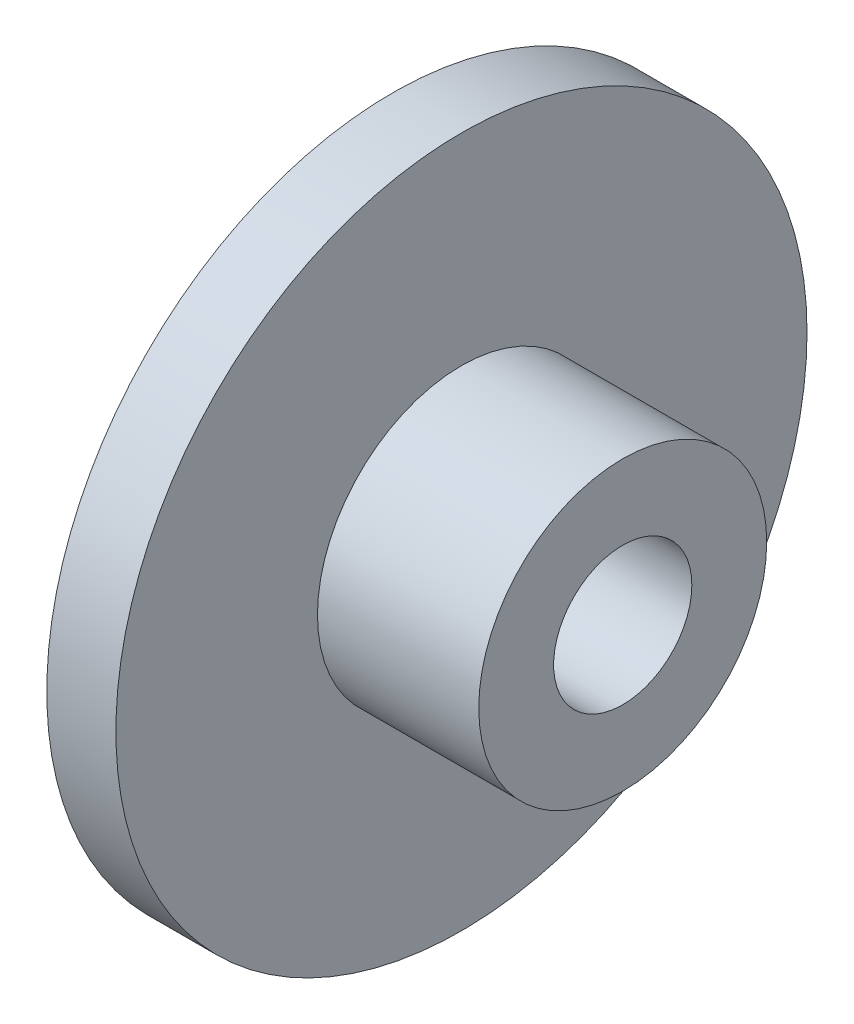
ISO-10303-21;
HEADER;
FILE_DESCRIPTION(('STEP AP214'),'2;1');
FILE_NAME('part.step','',(''),(''),'','','');
FILE_SCHEMA(('AUTOMOTIVE_DESIGN { 1 0 10303 214 1 1 1 1 }'));
ENDSEC;
DATA;
#1=APPLICATION_CONTEXT('core data for automotive mechanical design processes');
#2=APPLICATION_PROTOCOL_DEFINITION('international standard','automotive_design',2000,#1);
#3=PRODUCT_CONTEXT('',#1,'mechanical');
#4=PRODUCT('Part','Part','',(#3));
#5=PRODUCT_RELATED_PRODUCT_CATEGORY('part','',(#4));
#6=PRODUCT_DEFINITION_FORMATION('','',#4);
#7=PRODUCT_DEFINITION_CONTEXT('part definition',#1,'design');
#8=PRODUCT_DEFINITION('design','',#6,#7);
#9=PRODUCT_DEFINITION_SHAPE('','',#8);
#10=(LENGTH_UNIT() NAMED_UNIT(*) SI_UNIT(.MILLI.,.METRE.));
#11=(NAMED_UNIT(*) PLANE_ANGLE_UNIT() SI_UNIT($,.RADIAN.));
#12=(NAMED_UNIT(*) SI_UNIT($,.STERADIAN.) SOLID_ANGLE_UNIT());
#13=UNCERTAINTY_MEASURE_WITH_UNIT(LENGTH_MEASURE(1.E-05),#10,'distance_accuracy_value','');
#14=(GEOMETRIC_REPRESENTATION_CONTEXT(3) GLOBAL_UNCERTAINTY_ASSIGNED_CONTEXT((#13)) GLOBAL_UNIT_ASSIGNED_CONTEXT((#10,
#11,#12)) REPRESENTATION_CONTEXT('',''));
#15=CARTESIAN_POINT('',(0.,0.,0.));
#16=DIRECTION('',(0.,0.,1.));
#17=DIRECTION('',(1.,0.,0.));
#18=AXIS2_PLACEMENT_3D('',#15,#16,#17);
#19=CARTESIAN_POINT('',(3.,0.,0.));
#20=DIRECTION('',(-1.,0.,0.));
#21=DIRECTION('',(0.,0.,1.));
#22=AXIS2_PLACEMENT_3D('',#19,#20,#21);
#23=CYLINDRICAL_SURFACE('',#22,30.);
#24=CARTESIAN_POINT('',(3.,0.,0.));
#25=DIRECTION('',(1.,0.,0.));
#26=DIRECTION('',(0.,0.,-1.));
#27=AXIS2_PLACEMENT_3D('',#24,#25,#26);
#28=CIRCLE('',#27,30.);
#29=CARTESIAN_POINT('',(3.,0.,-30.));
#30=VERTEX_POINT('',#29);
#31=EDGE_CURVE('E51',#30,#30,#28,.T.);
#32=ORIENTED_EDGE('',*,*,#31,.F.);
#33=EDGE_LOOP('',(#32));
#34=FACE_BOUND('',#33,.T.);
#35=CARTESIAN_POINT('',(-3.,0.,0.));
#36=DIRECTION('',(1.,0.,0.));
#37=DIRECTION('',(0.,0.,-1.));
#38=AXIS2_PLACEMENT_3D('',#35,#36,#37);
#39=CIRCLE('',#38,30.);
#40=CARTESIAN_POINT('',(-3.,0.,-30.));
#41=VERTEX_POINT('',#40);
#42=EDGE_CURVE('E46',#41,#41,#39,.T.);
#43=ORIENTED_EDGE('',*,*,#42,.T.);
#44=EDGE_LOOP('',(#43));
#45=FACE_BOUND('',#44,.T.);
#46=ADVANCED_FACE('F43',(#34,#45),#23,.T.);
#47=CARTESIAN_POINT('',(3.,0.,0.));
#48=DIRECTION('',(1.,0.,0.));
#49=DIRECTION('',(0.,0.,-1.));
#50=AXIS2_PLACEMENT_3D('',#47,#48,#49);
#51=PLANE('',#50);
#52=CARTESIAN_POINT('',(3.,0.,0.));
#53=DIRECTION('',(1.,0.,0.));
#54=DIRECTION('',(0.,0.,-1.));
#55=AXIS2_PLACEMENT_3D('',#52,#53,#54);
#56=CIRCLE('',#55,12.5);
#57=CARTESIAN_POINT('',(3.,0.,-12.5));
#58=VERTEX_POINT('',#57);
#59=EDGE_CURVE('E10',#58,#58,#56,.T.);
#60=ORIENTED_EDGE('',*,*,#59,.F.);
#61=EDGE_LOOP('',(#60));
#62=FACE_BOUND('',#61,.T.);
#63=ORIENTED_EDGE('',*,*,#31,.T.);
#64=EDGE_LOOP('',(#63));
#65=FACE_BOUND('',#64,.T.);
#66=ADVANCED_FACE('F91',(#62,#65),#51,.T.);
#67=CARTESIAN_POINT('',(-3.,0.,0.));
#68=DIRECTION('',(1.,0.,0.));
#69=DIRECTION('',(0.,0.,-1.));
#70=AXIS2_PLACEMENT_3D('',#67,#68,#69);
#71=PLANE('',#70);
#72=CARTESIAN_POINT('',(-3.,0.,0.));
#73=DIRECTION('',(1.,0.,0.));
#74=DIRECTION('',(0.,0.,-1.));
#75=AXIS2_PLACEMENT_3D('',#72,#73,#74);
#76=CIRCLE('',#75,6.);
#77=CARTESIAN_POINT('',(-3.,0.,-6.));
#78=VERTEX_POINT('',#77);
#79=EDGE_CURVE('E65',#78,#78,#76,.T.);
#80=ORIENTED_EDGE('',*,*,#79,.T.);
#81=EDGE_LOOP('',(#80));
#82=FACE_BOUND('',#81,.T.);
#83=ORIENTED_EDGE('',*,*,#42,.F.);
#84=EDGE_LOOP('',(#83));
#85=FACE_BOUND('',#84,.T.);
#86=ADVANCED_FACE('F72',(#82,#85),#71,.F.);
#87=CARTESIAN_POINT('',(17.,0.,0.));
#88=DIRECTION('',(-1.,0.,0.));
#89=DIRECTION('',(0.,0.,1.));
#90=AXIS2_PLACEMENT_3D('',#87,#88,#89);
#91=CYLINDRICAL_SURFACE('',#90,12.5);
#92=CARTESIAN_POINT('',(17.,0.,0.));
#93=DIRECTION('',(1.,0.,0.));
#94=DIRECTION('',(0.,0.,-1.));
#95=AXIS2_PLACEMENT_3D('',#92,#93,#94);
#96=CIRCLE('',#95,12.5);
#97=CARTESIAN_POINT('',(17.,0.,-12.5));
#98=VERTEX_POINT('',#97);
#99=EDGE_CURVE('E59',#98,#98,#96,.T.);
#100=ORIENTED_EDGE('',*,*,#99,.F.);
#101=EDGE_LOOP('',(#100));
#102=FACE_BOUND('',#101,.T.);
#103=ORIENTED_EDGE('',*,*,#59,.T.);
#104=EDGE_LOOP('',(#103));
#105=FACE_BOUND('',#104,.T.);
#106=ADVANCED_FACE('F84',(#102,#105),#91,.T.);
#107=CARTESIAN_POINT('',(17.,0.,0.));
#108=DIRECTION('',(1.,0.,0.));
#109=DIRECTION('',(0.,0.,-1.));
#110=AXIS2_PLACEMENT_3D('',#107,#108,#109);
#111=PLANE('',#110);
#112=CARTESIAN_POINT('',(17.,0.,0.));
#113=DIRECTION('',(1.,0.,0.));
#114=DIRECTION('',(0.,0.,-1.));
#115=AXIS2_PLACEMENT_3D('',#112,#113,#114);
#116=CIRCLE('',#115,6.);
#117=CARTESIAN_POINT('',(17.,0.,-6.));
#118=VERTEX_POINT('',#117);
#119=EDGE_CURVE('E64',#118,#118,#116,.T.);
#120=ORIENTED_EDGE('',*,*,#119,.F.);
#121=EDGE_LOOP('',(#120));
#122=FACE_BOUND('',#121,.T.);
#123=ORIENTED_EDGE('',*,*,#99,.T.);
#124=EDGE_LOOP('',(#123));
#125=FACE_BOUND('',#124,.T.);
#126=ADVANCED_FACE('F80',(#122,#125),#111,.T.);
#127=CARTESIAN_POINT('',(-3.,0.,0.));
#128=DIRECTION('',(1.,0.,0.));
#129=DIRECTION('',(0.,0.,-1.));
#130=AXIS2_PLACEMENT_3D('',#127,#128,#129);
#131=CYLINDRICAL_SURFACE('',#130,6.);
#132=ORIENTED_EDGE('',*,*,#79,.F.);
#133=EDGE_LOOP('',(#132));
#134=FACE_BOUND('',#133,.T.);
#135=ORIENTED_EDGE('',*,*,#119,.T.);
#136=EDGE_LOOP('',(#135));
#137=FACE_BOUND('',#136,.T.);
#138=ADVANCED_FACE('F74',(#134,#137),#131,.F.);
#139=CLOSED_SHELL('',(#46,#66,#86,#106,#126,#138));
#140=MANIFOLD_SOLID_BREP('B2',#139);
#141=ADVANCED_BREP_SHAPE_REPRESENTATION('',(#18,#140),#14);
#142=SHAPE_DEFINITION_REPRESENTATION(#9,#141);
ENDSEC;
END-ISO-10303-21;
